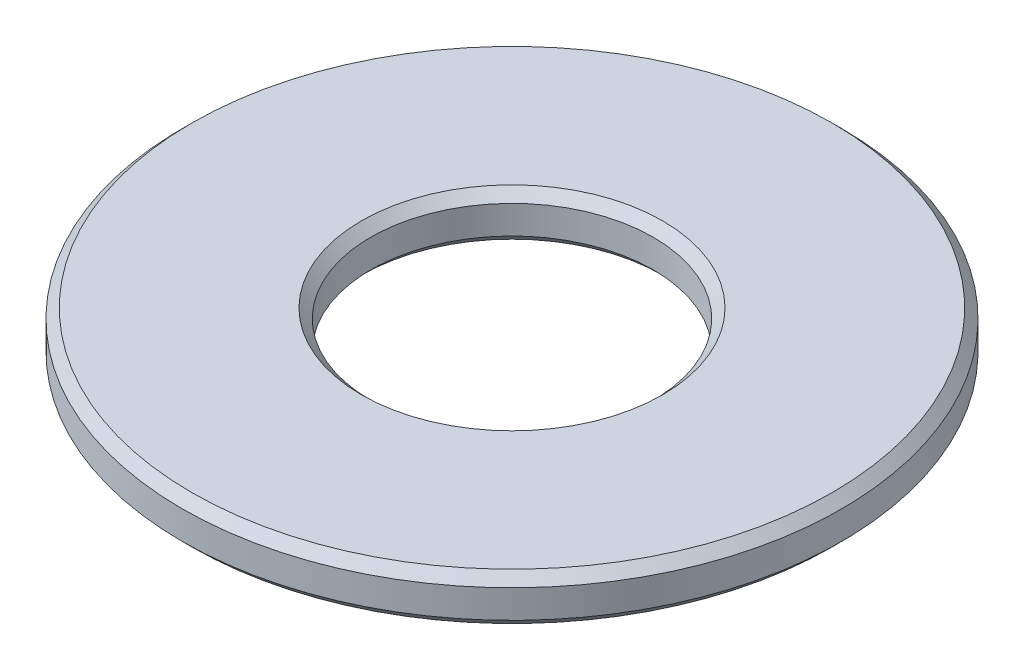
ISO-10303-21;
HEADER;
FILE_DESCRIPTION(('STEP AP214'),'2;1');
FILE_NAME('part.step','',(''),(''),'','','');
FILE_SCHEMA(('AUTOMOTIVE_DESIGN { 1 0 10303 214 1 1 1 1 }'));
ENDSEC;
DATA;
#1=APPLICATION_CONTEXT('core data for automotive mechanical design processes');
#2=APPLICATION_PROTOCOL_DEFINITION('international standard','automotive_design',2000,#1);
#3=PRODUCT_CONTEXT('',#1,'mechanical');
#4=PRODUCT('Part','Part','',(#3));
#5=PRODUCT_RELATED_PRODUCT_CATEGORY('part','',(#4));
#6=PRODUCT_DEFINITION_FORMATION('','',#4);
#7=PRODUCT_DEFINITION_CONTEXT('part definition',#1,'design');
#8=PRODUCT_DEFINITION('design','',#6,#7);
#9=PRODUCT_DEFINITION_SHAPE('','',#8);
#10=(LENGTH_UNIT() NAMED_UNIT(*) SI_UNIT(.MILLI.,.METRE.));
#11=(NAMED_UNIT(*) PLANE_ANGLE_UNIT() SI_UNIT($,.RADIAN.));
#12=(NAMED_UNIT(*) SI_UNIT($,.STERADIAN.) SOLID_ANGLE_UNIT());
#13=UNCERTAINTY_MEASURE_WITH_UNIT(LENGTH_MEASURE(1.E-05),#10,'distance_accuracy_value','');
#14=(GEOMETRIC_REPRESENTATION_CONTEXT(3) GLOBAL_UNCERTAINTY_ASSIGNED_CONTEXT((#13)) GLOBAL_UNIT_ASSIGNED_CONTEXT((#10,
#11,#12)) REPRESENTATION_CONTEXT('',''));
#15=CARTESIAN_POINT('',(0.,0.,0.));
#16=DIRECTION('',(0.,0.,1.));
#17=DIRECTION('',(1.,0.,0.));
#18=AXIS2_PLACEMENT_3D('',#15,#16,#17);
#19=CARTESIAN_POINT('',(0.,1.,0.));
#20=DIRECTION('',(0.,1.,0.));
#21=DIRECTION('',(0.,0.,1.));
#22=AXIS2_PLACEMENT_3D('',#19,#20,#21);
#23=PLANE('',#22);
#24=CARTESIAN_POINT('',(0.,1.,0.));
#25=DIRECTION('',(0.,1.,0.));
#26=DIRECTION('',(0.,0.,1.));
#27=AXIS2_PLACEMENT_3D('',#24,#25,#26);
#28=CIRCLE('',#27,3.20000000000001);
#29=CARTESIAN_POINT('',(0.,1.,3.20000000000001));
#30=VERTEX_POINT('',#29);
#31=EDGE_CURVE('E10',#30,#30,#28,.F.);
#32=ORIENTED_EDGE('',*,*,#31,.T.);
#33=EDGE_LOOP('',(#32));
#34=FACE_BOUND('',#33,.T.);
#35=CARTESIAN_POINT('',(0.,1.,0.));
#36=DIRECTION('',(0.,1.,0.));
#37=DIRECTION('',(0.,0.,1.));
#38=AXIS2_PLACEMENT_3D('',#35,#36,#37);
#39=CIRCLE('',#38,6.8);
#40=CARTESIAN_POINT('',(0.,1.,6.8));
#41=VERTEX_POINT('',#40);
#42=EDGE_CURVE('E37',#41,#41,#39,.T.);
#43=ORIENTED_EDGE('',*,*,#42,.T.);
#44=EDGE_LOOP('',(#43));
#45=FACE_BOUND('',#44,.T.);
#46=ADVANCED_FACE('F30',(#34,#45),#23,.T.);
#47=CARTESIAN_POINT('',(0.,0.,0.));
#48=DIRECTION('',(0.,1.,0.));
#49=DIRECTION('',(0.,0.,1.));
#50=AXIS2_PLACEMENT_3D('',#47,#48,#49);
#51=PLANE('',#50);
#52=CARTESIAN_POINT('',(0.,0.,0.));
#53=DIRECTION('',(0.,1.,0.));
#54=DIRECTION('',(0.,0.,1.));
#55=AXIS2_PLACEMENT_3D('',#52,#53,#54);
#56=CIRCLE('',#55,3.2);
#57=CARTESIAN_POINT('',(0.,0.,3.2));
#58=VERTEX_POINT('',#57);
#59=EDGE_CURVE('E56',#58,#58,#56,.T.);
#60=ORIENTED_EDGE('',*,*,#59,.T.);
#61=EDGE_LOOP('',(#60));
#62=FACE_BOUND('',#61,.T.);
#63=CARTESIAN_POINT('',(0.,0.,0.));
#64=DIRECTION('',(0.,1.,0.));
#65=DIRECTION('',(0.,0.,1.));
#66=AXIS2_PLACEMENT_3D('',#63,#64,#65);
#67=CIRCLE('',#66,6.8);
#68=CARTESIAN_POINT('',(0.,0.,6.8));
#69=VERTEX_POINT('',#68);
#70=EDGE_CURVE('E59',#69,#69,#67,.F.);
#71=ORIENTED_EDGE('',*,*,#70,.T.);
#72=EDGE_LOOP('',(#71));
#73=FACE_BOUND('',#72,.T.);
#74=ADVANCED_FACE('F63',(#62,#73),#51,.F.);
#75=CARTESIAN_POINT('',(0.,1.,0.));
#76=DIRECTION('',(0.,-1.,0.));
#77=DIRECTION('',(0.,0.,-1.));
#78=AXIS2_PLACEMENT_3D('',#75,#76,#77);
#79=CYLINDRICAL_SURFACE('',#78,7.);
#80=CARTESIAN_POINT('',(0.,0.199999999999999,0.));
#81=DIRECTION('',(0.,1.,0.));
#82=DIRECTION('',(0.,0.,1.));
#83=AXIS2_PLACEMENT_3D('',#80,#81,#82);
#84=CIRCLE('',#83,7.);
#85=CARTESIAN_POINT('',(0.,0.199999999999999,7.));
#86=VERTEX_POINT('',#85);
#87=EDGE_CURVE('E41',#86,#86,#84,.T.);
#88=ORIENTED_EDGE('',*,*,#87,.T.);
#89=EDGE_LOOP('',(#88));
#90=FACE_BOUND('',#89,.T.);
#91=CARTESIAN_POINT('',(0.,0.799999999999998,0.));
#92=DIRECTION('',(0.,1.,0.));
#93=DIRECTION('',(0.,0.,1.));
#94=AXIS2_PLACEMENT_3D('',#91,#92,#93);
#95=CIRCLE('',#94,7.);
#96=CARTESIAN_POINT('',(0.,0.799999999999998,7.));
#97=VERTEX_POINT('',#96);
#98=EDGE_CURVE('E45',#97,#97,#95,.F.);
#99=ORIENTED_EDGE('',*,*,#98,.T.);
#100=EDGE_LOOP('',(#99));
#101=FACE_BOUND('',#100,.T.);
#102=ADVANCED_FACE('F73',(#90,#101),#79,.T.);
#103=CARTESIAN_POINT('',(0.,1.,0.));
#104=DIRECTION('',(0.,-1.,0.));
#105=DIRECTION('',(0.,0.,-1.));
#106=AXIS2_PLACEMENT_3D('',#103,#104,#105);
#107=CYLINDRICAL_SURFACE('',#106,3.);
#108=CARTESIAN_POINT('',(0.,0.200000000000001,0.));
#109=DIRECTION('',(0.,1.,0.));
#110=DIRECTION('',(0.,0.,1.));
#111=AXIS2_PLACEMENT_3D('',#108,#109,#110);
#112=CIRCLE('',#111,3.);
#113=CARTESIAN_POINT('',(0.,0.200000000000001,3.));
#114=VERTEX_POINT('',#113);
#115=EDGE_CURVE('E50',#114,#114,#112,.F.);
#116=ORIENTED_EDGE('',*,*,#115,.T.);
#117=EDGE_LOOP('',(#116));
#118=FACE_BOUND('',#117,.T.);
#119=CARTESIAN_POINT('',(0.,0.799999999999996,0.));
#120=DIRECTION('',(0.,1.,0.));
#121=DIRECTION('',(0.,0.,1.));
#122=AXIS2_PLACEMENT_3D('',#119,#120,#121);
#123=CIRCLE('',#122,3.);
#124=CARTESIAN_POINT('',(0.,0.799999999999996,3.));
#125=VERTEX_POINT('',#124);
#126=EDGE_CURVE('E53',#125,#125,#123,.T.);
#127=ORIENTED_EDGE('',*,*,#126,.T.);
#128=EDGE_LOOP('',(#127));
#129=FACE_BOUND('',#128,.T.);
#130=ADVANCED_FACE('F76',(#118,#129),#107,.F.);
#131=CARTESIAN_POINT('',(0.,0.,0.));
#132=DIRECTION('',(0.,-1.,0.));
#133=DIRECTION('',(0.,0.,-1.));
#134=AXIS2_PLACEMENT_3D('',#131,#132,#133);
#135=CONICAL_SURFACE('',#134,3.2,0.785398163397446);
#136=ORIENTED_EDGE('',*,*,#115,.F.);
#137=EDGE_LOOP('',(#136));
#138=FACE_BOUND('',#137,.T.);
#139=ORIENTED_EDGE('',*,*,#59,.F.);
#140=EDGE_LOOP('',(#139));
#141=FACE_BOUND('',#140,.T.);
#142=ADVANCED_FACE('F69',(#138,#141),#135,.F.);
#143=CARTESIAN_POINT('',(0.,0.199999999999999,0.));
#144=DIRECTION('',(0.,1.,0.));
#145=DIRECTION('',(0.,0.,1.));
#146=AXIS2_PLACEMENT_3D('',#143,#144,#145);
#147=CONICAL_SURFACE('',#146,7.,0.78539816339745);
#148=ORIENTED_EDGE('',*,*,#70,.F.);
#149=EDGE_LOOP('',(#148));
#150=FACE_BOUND('',#149,.T.);
#151=ORIENTED_EDGE('',*,*,#87,.F.);
#152=EDGE_LOOP('',(#151));
#153=FACE_BOUND('',#152,.T.);
#154=ADVANCED_FACE('F65',(#150,#153),#147,.T.);
#155=CARTESIAN_POINT('',(0.,0.799999999999996,0.));
#156=DIRECTION('',(0.,1.,0.));
#157=DIRECTION('',(0.,0.,1.));
#158=AXIS2_PLACEMENT_3D('',#155,#156,#157);
#159=CONICAL_SURFACE('',#158,3.,0.785398163397449);
#160=ORIENTED_EDGE('',*,*,#31,.F.);
#161=EDGE_LOOP('',(#160));
#162=FACE_BOUND('',#161,.T.);
#163=ORIENTED_EDGE('',*,*,#126,.F.);
#164=EDGE_LOOP('',(#163));
#165=FACE_BOUND('',#164,.T.);
#166=ADVANCED_FACE('F68',(#162,#165),#159,.F.);
#167=CARTESIAN_POINT('',(0.,1.,0.));
#168=DIRECTION('',(0.,-1.,0.));
#169=DIRECTION('',(0.,0.,-1.));
#170=AXIS2_PLACEMENT_3D('',#167,#168,#169);
#171=CONICAL_SURFACE('',#170,6.8,0.785398163397442);
#172=ORIENTED_EDGE('',*,*,#98,.F.);
#173=EDGE_LOOP('',(#172));
#174=FACE_BOUND('',#173,.T.);
#175=ORIENTED_EDGE('',*,*,#42,.F.);
#176=EDGE_LOOP('',(#175));
#177=FACE_BOUND('',#176,.T.);
#178=ADVANCED_FACE('F32',(#174,#177),#171,.T.);
#179=CLOSED_SHELL('',(#46,#74,#102,#130,#142,#154,#166,#178));
#180=MANIFOLD_SOLID_BREP('B2',#179);
#181=ADVANCED_BREP_SHAPE_REPRESENTATION('',(#18,#180),#14);
#182=SHAPE_DEFINITION_REPRESENTATION(#9,#181);
ENDSEC;
END-ISO-10303-21;
